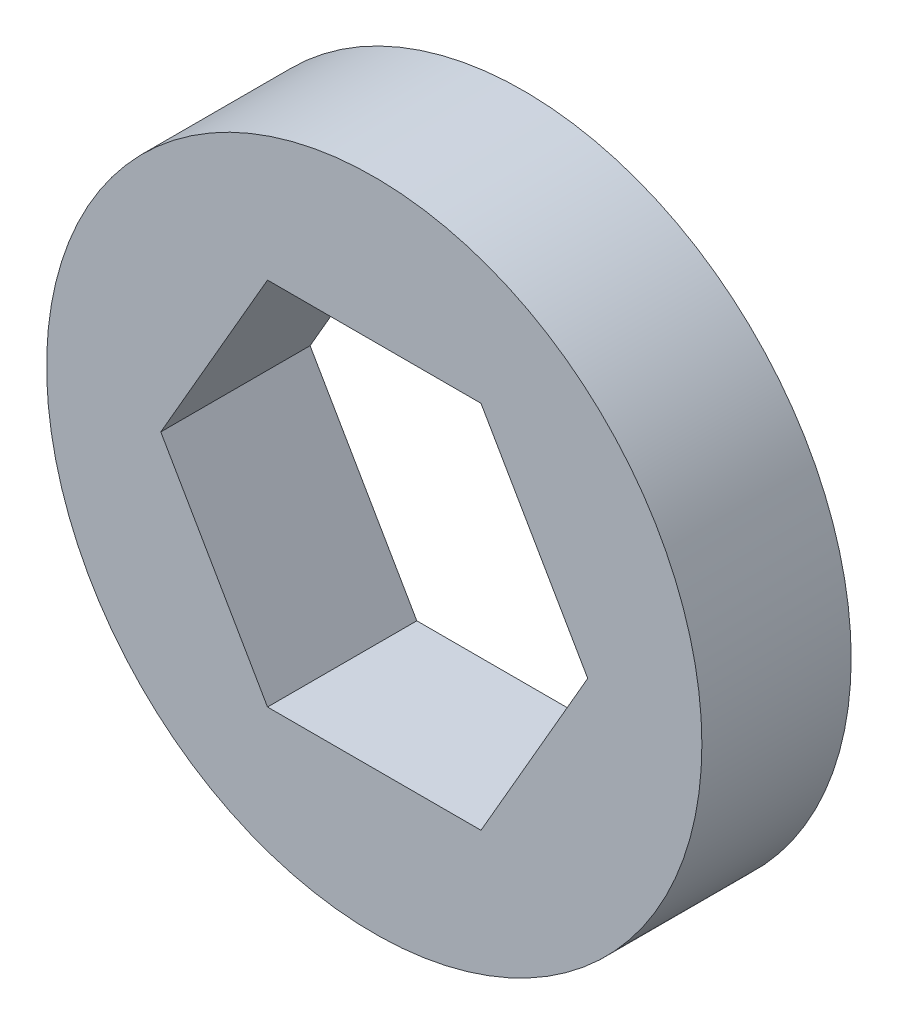
ISO-10303-21;
HEADER;
FILE_DESCRIPTION(('STEP AP214'),'2;1');
FILE_NAME('part.step','',(''),(''),'','','');
FILE_SCHEMA(('AUTOMOTIVE_DESIGN { 1 0 10303 214 1 1 1 1 }'));
ENDSEC;
DATA;
#1=APPLICATION_CONTEXT('core data for automotive mechanical design processes');
#2=APPLICATION_PROTOCOL_DEFINITION('international standard','automotive_design',2000,#1);
#3=PRODUCT_CONTEXT('',#1,'mechanical');
#4=PRODUCT('Part','Part','',(#3));
#5=PRODUCT_RELATED_PRODUCT_CATEGORY('part','',(#4));
#6=PRODUCT_DEFINITION_FORMATION('','',#4);
#7=PRODUCT_DEFINITION_CONTEXT('part definition',#1,'design');
#8=PRODUCT_DEFINITION('design','',#6,#7);
#9=PRODUCT_DEFINITION_SHAPE('','',#8);
#10=(LENGTH_UNIT() NAMED_UNIT(*) SI_UNIT(.MILLI.,.METRE.));
#11=(NAMED_UNIT(*) PLANE_ANGLE_UNIT() SI_UNIT($,.RADIAN.));
#12=(NAMED_UNIT(*) SI_UNIT($,.STERADIAN.) SOLID_ANGLE_UNIT());
#13=UNCERTAINTY_MEASURE_WITH_UNIT(LENGTH_MEASURE(1.E-05),#10,'distance_accuracy_value','');
#14=(GEOMETRIC_REPRESENTATION_CONTEXT(3) GLOBAL_UNCERTAINTY_ASSIGNED_CONTEXT((#13)) GLOBAL_UNIT_ASSIGNED_CONTEXT((#10,
#11,#12)) REPRESENTATION_CONTEXT('',''));
#15=CARTESIAN_POINT('',(0.,0.,0.));
#16=DIRECTION('',(0.,0.,1.));
#17=DIRECTION('',(1.,0.,0.));
#18=AXIS2_PLACEMENT_3D('',#15,#16,#17);
#19=CARTESIAN_POINT('',(0.,0.,2.02565));
#20=DIRECTION('',(0.,0.,1.));
#21=DIRECTION('',(1.,0.,0.));
#22=AXIS2_PLACEMENT_3D('',#19,#20,#21);
#23=PLANE('',#22);
#24=CARTESIAN_POINT('',(0.,0.,2.02565));
#25=DIRECTION('',(0.,0.,1.));
#26=DIRECTION('',(1.,0.,0.));
#27=AXIS2_PLACEMENT_3D('',#24,#25,#26);
#28=CIRCLE('',#27,8.89);
#29=CARTESIAN_POINT('',(8.89,0.,2.02565));
#30=VERTEX_POINT('',#29);
#31=EDGE_CURVE('E11',#30,#30,#28,.T.);
#32=ORIENTED_EDGE('',*,*,#31,.T.);
#33=EDGE_LOOP('',(#32));
#34=FACE_BOUND('',#33,.T.);
#35=DIRECTION('',(0.5,-0.866025403784439,0.));
#36=VECTOR('',#35,1.);
#37=CARTESIAN_POINT('',(-5.79255525077951,0.,2.02565));
#38=LINE('',#37,#36);
#39=CARTESIAN_POINT('',(-5.79255525077951,0.,2.02565));
#40=VERTEX_POINT('',#39);
#41=CARTESIAN_POINT('',(-2.89627762538976,-5.0165,2.02565));
#42=VERTEX_POINT('',#41);
#43=EDGE_CURVE('E108',#40,#42,#38,.T.);
#44=ORIENTED_EDGE('',*,*,#43,.F.);
#45=DIRECTION('',(-0.5,-0.866025403784439,0.));
#46=VECTOR('',#45,1.);
#47=CARTESIAN_POINT('',(-2.89627762538976,5.0165,2.02565));
#48=LINE('',#47,#46);
#49=CARTESIAN_POINT('',(-2.89627762538976,5.0165,2.02565));
#50=VERTEX_POINT('',#49);
#51=EDGE_CURVE('E99',#50,#40,#48,.T.);
#52=ORIENTED_EDGE('',*,*,#51,.F.);
#53=DIRECTION('',(-1.,0.,0.));
#54=VECTOR('',#53,1.);
#55=CARTESIAN_POINT('',(2.89627762538976,5.0165,2.02565));
#56=LINE('',#55,#54);
#57=CARTESIAN_POINT('',(2.89627762538976,5.0165,2.02565));
#58=VERTEX_POINT('',#57);
#59=EDGE_CURVE('E133',#58,#50,#56,.T.);
#60=ORIENTED_EDGE('',*,*,#59,.F.);
#61=DIRECTION('',(-0.5,0.866025403784439,0.));
#62=VECTOR('',#61,1.);
#63=CARTESIAN_POINT('',(5.79255525077951,0.,2.02565));
#64=LINE('',#63,#62);
#65=CARTESIAN_POINT('',(5.79255525077951,0.,2.02565));
#66=VERTEX_POINT('',#65);
#67=EDGE_CURVE('E130',#66,#58,#64,.T.);
#68=ORIENTED_EDGE('',*,*,#67,.F.);
#69=DIRECTION('',(0.5,0.866025403784438,0.));
#70=VECTOR('',#69,1.);
#71=CARTESIAN_POINT('',(2.89627762538976,-5.0165,2.02565));
#72=LINE('',#71,#70);
#73=CARTESIAN_POINT('',(2.89627762538976,-5.0165,2.02565));
#74=VERTEX_POINT('',#73);
#75=EDGE_CURVE('E125',#74,#66,#72,.T.);
#76=ORIENTED_EDGE('',*,*,#75,.F.);
#77=DIRECTION('',(1.,0.,0.));
#78=VECTOR('',#77,1.);
#79=CARTESIAN_POINT('',(-2.89627762538976,-5.0165,2.02565));
#80=LINE('',#79,#78);
#81=EDGE_CURVE('E121',#42,#74,#80,.T.);
#82=ORIENTED_EDGE('',*,*,#81,.F.);
#83=EDGE_LOOP('',(#44,#52,#60,#68,#76,#82));
#84=FACE_BOUND('',#83,.T.);
#85=ADVANCED_FACE('F45',(#34,#84),#23,.T.);
#86=CARTESIAN_POINT('',(0.,0.,-2.02565));
#87=DIRECTION('',(0.,0.,1.));
#88=DIRECTION('',(1.,0.,0.));
#89=AXIS2_PLACEMENT_3D('',#86,#87,#88);
#90=PLANE('',#89);
#91=CARTESIAN_POINT('',(0.,0.,-2.02565));
#92=DIRECTION('',(0.,0.,1.));
#93=DIRECTION('',(1.,0.,0.));
#94=AXIS2_PLACEMENT_3D('',#91,#92,#93);
#95=CIRCLE('',#94,8.89);
#96=CARTESIAN_POINT('',(8.89,0.,-2.02565));
#97=VERTEX_POINT('',#96);
#98=EDGE_CURVE('E49',#97,#97,#95,.T.);
#99=ORIENTED_EDGE('',*,*,#98,.F.);
#100=EDGE_LOOP('',(#99));
#101=FACE_BOUND('',#100,.T.);
#102=DIRECTION('',(-0.5,-0.866025403784439,0.));
#103=VECTOR('',#102,1.);
#104=CARTESIAN_POINT('',(-2.89627762538976,5.0165,-2.02565));
#105=LINE('',#104,#103);
#106=CARTESIAN_POINT('',(-2.89627762538976,5.0165,-2.02565));
#107=VERTEX_POINT('',#106);
#108=CARTESIAN_POINT('',(-5.79255525077951,0.,-2.02565));
#109=VERTEX_POINT('',#108);
#110=EDGE_CURVE('E69',#107,#109,#105,.T.);
#111=ORIENTED_EDGE('',*,*,#110,.T.);
#112=DIRECTION('',(0.5,-0.866025403784439,0.));
#113=VECTOR('',#112,1.);
#114=CARTESIAN_POINT('',(-5.79255525077951,0.,-2.02565));
#115=LINE('',#114,#113);
#116=CARTESIAN_POINT('',(-2.89627762538976,-5.0165,-2.02565));
#117=VERTEX_POINT('',#116);
#118=EDGE_CURVE('E115',#109,#117,#115,.T.);
#119=ORIENTED_EDGE('',*,*,#118,.T.);
#120=DIRECTION('',(1.,0.,0.));
#121=VECTOR('',#120,1.);
#122=CARTESIAN_POINT('',(-2.89627762538976,-5.0165,-2.02565));
#123=LINE('',#122,#121);
#124=CARTESIAN_POINT('',(2.89627762538976,-5.0165,-2.02565));
#125=VERTEX_POINT('',#124);
#126=EDGE_CURVE('E140',#117,#125,#123,.T.);
#127=ORIENTED_EDGE('',*,*,#126,.T.);
#128=DIRECTION('',(0.5,0.866025403784438,0.));
#129=VECTOR('',#128,1.);
#130=CARTESIAN_POINT('',(2.89627762538976,-5.0165,-2.02565));
#131=LINE('',#130,#129);
#132=CARTESIAN_POINT('',(5.79255525077951,0.,-2.02565));
#133=VERTEX_POINT('',#132);
#134=EDGE_CURVE('E144',#125,#133,#131,.T.);
#135=ORIENTED_EDGE('',*,*,#134,.T.);
#136=DIRECTION('',(-0.5,0.866025403784439,0.));
#137=VECTOR('',#136,1.);
#138=CARTESIAN_POINT('',(5.79255525077951,0.,-2.02565));
#139=LINE('',#138,#137);
#140=CARTESIAN_POINT('',(2.89627762538976,5.0165,-2.02565));
#141=VERTEX_POINT('',#140);
#142=EDGE_CURVE('E148',#133,#141,#139,.T.);
#143=ORIENTED_EDGE('',*,*,#142,.T.);
#144=DIRECTION('',(-1.,0.,0.));
#145=VECTOR('',#144,1.);
#146=CARTESIAN_POINT('',(2.89627762538976,5.0165,-2.02565));
#147=LINE('',#146,#145);
#148=EDGE_CURVE('E109',#141,#107,#147,.T.);
#149=ORIENTED_EDGE('',*,*,#148,.T.);
#150=EDGE_LOOP('',(#111,#119,#127,#135,#143,#149));
#151=FACE_BOUND('',#150,.T.);
#152=ADVANCED_FACE('F172',(#101,#151),#90,.F.);
#153=CARTESIAN_POINT('',(0.,0.,2.02565));
#154=DIRECTION('',(0.,0.,-1.));
#155=DIRECTION('',(-1.,0.,0.));
#156=AXIS2_PLACEMENT_3D('',#153,#154,#155);
#157=CYLINDRICAL_SURFACE('',#156,8.89);
#158=ORIENTED_EDGE('',*,*,#31,.F.);
#159=EDGE_LOOP('',(#158));
#160=FACE_BOUND('',#159,.T.);
#161=ORIENTED_EDGE('',*,*,#98,.T.);
#162=EDGE_LOOP('',(#161));
#163=FACE_BOUND('',#162,.T.);
#164=ADVANCED_FACE('F47',(#160,#163),#157,.T.);
#165=CARTESIAN_POINT('',(-2.89627762538976,5.0165,2.02565));
#166=DIRECTION('',(0.866025403784439,-0.5,0.));
#167=DIRECTION('',(0.5,0.866025403784439,0.));
#168=AXIS2_PLACEMENT_3D('',#165,#166,#167);
#169=PLANE('',#168);
#170=ORIENTED_EDGE('',*,*,#110,.F.);
#171=DIRECTION('',(0.,0.,-1.));
#172=VECTOR('',#171,1.);
#173=CARTESIAN_POINT('',(-2.89627762538976,5.0165,2.02565));
#174=LINE('',#173,#172);
#175=EDGE_CURVE('E103',#50,#107,#174,.T.);
#176=ORIENTED_EDGE('',*,*,#175,.F.);
#177=ORIENTED_EDGE('',*,*,#51,.T.);
#178=DIRECTION('',(0.,0.,-1.));
#179=VECTOR('',#178,1.);
#180=CARTESIAN_POINT('',(-5.79255525077951,0.,2.02565));
#181=LINE('',#180,#179);
#182=EDGE_CURVE('E102',#40,#109,#181,.T.);
#183=ORIENTED_EDGE('',*,*,#182,.T.);
#184=EDGE_LOOP('',(#170,#176,#177,#183));
#185=FACE_BOUND('',#184,.T.);
#186=ADVANCED_FACE('F101',(#185),#169,.T.);
#187=CARTESIAN_POINT('',(-5.79255525077951,0.,2.02565));
#188=DIRECTION('',(0.866025403784439,0.5,0.));
#189=DIRECTION('',(-0.5,0.866025403784439,0.));
#190=AXIS2_PLACEMENT_3D('',#187,#188,#189);
#191=PLANE('',#190);
#192=ORIENTED_EDGE('',*,*,#118,.F.);
#193=ORIENTED_EDGE('',*,*,#182,.F.);
#194=ORIENTED_EDGE('',*,*,#43,.T.);
#195=DIRECTION('',(0.,0.,-1.));
#196=VECTOR('',#195,1.);
#197=CARTESIAN_POINT('',(-2.89627762538976,-5.0165,2.02565));
#198=LINE('',#197,#196);
#199=EDGE_CURVE('E117',#42,#117,#198,.T.);
#200=ORIENTED_EDGE('',*,*,#199,.T.);
#201=EDGE_LOOP('',(#192,#193,#194,#200));
#202=FACE_BOUND('',#201,.T.);
#203=ADVANCED_FACE('F112',(#202),#191,.T.);
#204=CARTESIAN_POINT('',(-2.89627762538976,-5.0165,2.02565));
#205=DIRECTION('',(0.,1.,0.));
#206=DIRECTION('',(-1.,0.,0.));
#207=AXIS2_PLACEMENT_3D('',#204,#205,#206);
#208=PLANE('',#207);
#209=ORIENTED_EDGE('',*,*,#126,.F.);
#210=ORIENTED_EDGE('',*,*,#199,.F.);
#211=ORIENTED_EDGE('',*,*,#81,.T.);
#212=DIRECTION('',(0.,0.,-1.));
#213=VECTOR('',#212,1.);
#214=CARTESIAN_POINT('',(2.89627762538976,-5.0165,2.02565));
#215=LINE('',#214,#213);
#216=EDGE_CURVE('E162',#74,#125,#215,.T.);
#217=ORIENTED_EDGE('',*,*,#216,.T.);
#218=EDGE_LOOP('',(#209,#210,#211,#217));
#219=FACE_BOUND('',#218,.T.);
#220=ADVANCED_FACE('F168',(#219),#208,.T.);
#221=CARTESIAN_POINT('',(2.89627762538976,-5.0165,2.02565));
#222=DIRECTION('',(-0.866025403784439,0.5,0.));
#223=DIRECTION('',(-0.5,-0.866025403784439,0.));
#224=AXIS2_PLACEMENT_3D('',#221,#222,#223);
#225=PLANE('',#224);
#226=ORIENTED_EDGE('',*,*,#134,.F.);
#227=ORIENTED_EDGE('',*,*,#216,.F.);
#228=ORIENTED_EDGE('',*,*,#75,.T.);
#229=DIRECTION('',(0.,0.,-1.));
#230=VECTOR('',#229,1.);
#231=CARTESIAN_POINT('',(5.79255525077951,0.,2.02565));
#232=LINE('',#231,#230);
#233=EDGE_CURVE('E159',#66,#133,#232,.T.);
#234=ORIENTED_EDGE('',*,*,#233,.T.);
#235=EDGE_LOOP('',(#226,#227,#228,#234));
#236=FACE_BOUND('',#235,.T.);
#237=ADVANCED_FACE('F180',(#236),#225,.T.);
#238=CARTESIAN_POINT('',(5.79255525077951,0.,2.02565));
#239=DIRECTION('',(-0.866025403784439,-0.5,0.));
#240=DIRECTION('',(0.5,-0.866025403784439,0.));
#241=AXIS2_PLACEMENT_3D('',#238,#239,#240);
#242=PLANE('',#241);
#243=ORIENTED_EDGE('',*,*,#142,.F.);
#244=ORIENTED_EDGE('',*,*,#233,.F.);
#245=ORIENTED_EDGE('',*,*,#67,.T.);
#246=DIRECTION('',(0.,0.,-1.));
#247=VECTOR('',#246,1.);
#248=CARTESIAN_POINT('',(2.89627762538976,5.0165,2.02565));
#249=LINE('',#248,#247);
#250=EDGE_CURVE('E61',#58,#141,#249,.T.);
#251=ORIENTED_EDGE('',*,*,#250,.T.);
#252=EDGE_LOOP('',(#243,#244,#245,#251));
#253=FACE_BOUND('',#252,.T.);
#254=ADVANCED_FACE('F178',(#253),#242,.T.);
#255=CARTESIAN_POINT('',(2.89627762538976,5.0165,2.02565));
#256=DIRECTION('',(0.,-1.,0.));
#257=DIRECTION('',(1.,0.,0.));
#258=AXIS2_PLACEMENT_3D('',#255,#256,#257);
#259=PLANE('',#258);
#260=ORIENTED_EDGE('',*,*,#148,.F.);
#261=ORIENTED_EDGE('',*,*,#250,.F.);
#262=ORIENTED_EDGE('',*,*,#59,.T.);
#263=ORIENTED_EDGE('',*,*,#175,.T.);
#264=EDGE_LOOP('',(#260,#261,#262,#263));
#265=FACE_BOUND('',#264,.T.);
#266=ADVANCED_FACE('F174',(#265),#259,.T.);
#267=CLOSED_SHELL('',(#85,#152,#164,#186,#203,#220,#237,#254,#266));
#268=MANIFOLD_SOLID_BREP('B2',#267);
#269=ADVANCED_BREP_SHAPE_REPRESENTATION('',(#18,#268),#14);
#270=SHAPE_DEFINITION_REPRESENTATION(#9,#269);
ENDSEC;
END-ISO-10303-21;
